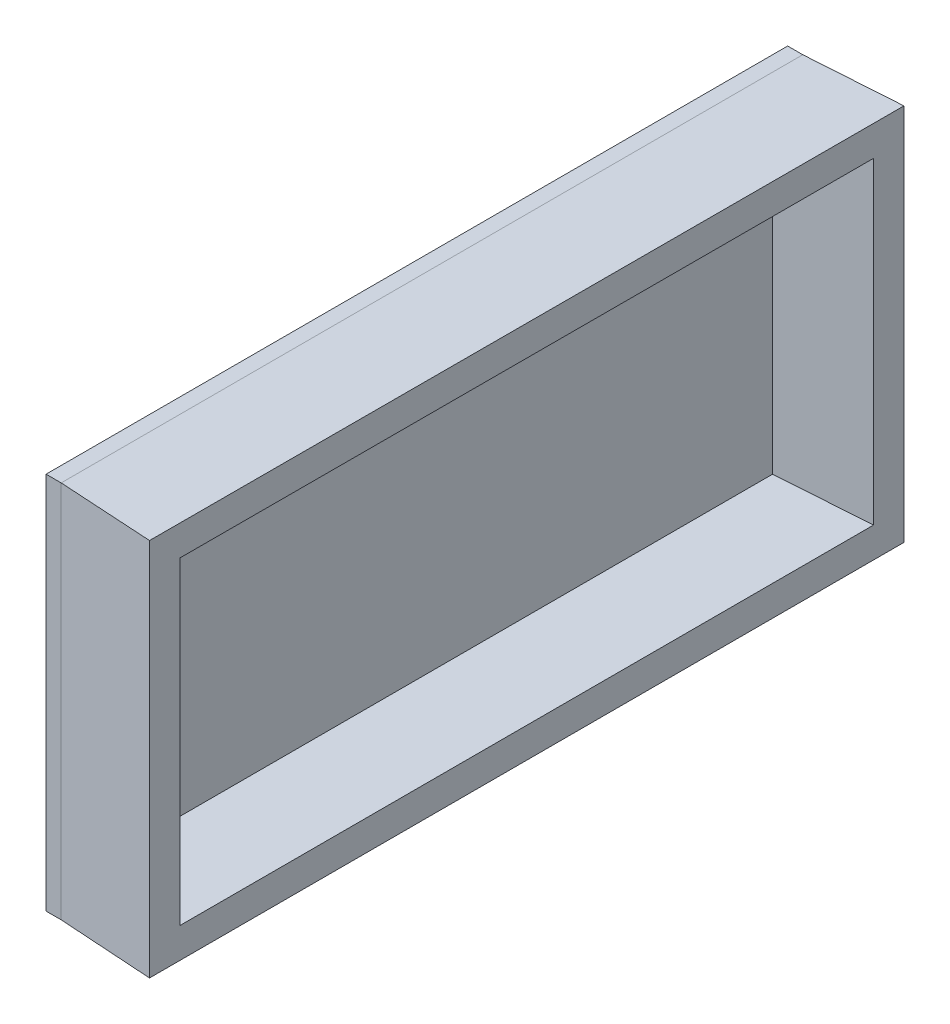
ISO-10303-21;
HEADER;
FILE_DESCRIPTION(('STEP AP214'),'2;1');
FILE_NAME('part.step','',(''),(''),'','','');
FILE_SCHEMA(('AUTOMOTIVE_DESIGN { 1 0 10303 214 1 1 1 1 }'));
ENDSEC;
DATA;
#1=APPLICATION_CONTEXT('core data for automotive mechanical design processes');
#2=APPLICATION_PROTOCOL_DEFINITION('international standard','automotive_design',2000,#1);
#3=PRODUCT_CONTEXT('',#1,'mechanical');
#4=PRODUCT('Part','Part','',(#3));
#5=PRODUCT_RELATED_PRODUCT_CATEGORY('part','',(#4));
#6=PRODUCT_DEFINITION_FORMATION('','',#4);
#7=PRODUCT_DEFINITION_CONTEXT('part definition',#1,'design');
#8=PRODUCT_DEFINITION('design','',#6,#7);
#9=PRODUCT_DEFINITION_SHAPE('','',#8);
#10=(LENGTH_UNIT() NAMED_UNIT(*) SI_UNIT(.MILLI.,.METRE.));
#11=(NAMED_UNIT(*) PLANE_ANGLE_UNIT() SI_UNIT($,.RADIAN.));
#12=(NAMED_UNIT(*) SI_UNIT($,.STERADIAN.) SOLID_ANGLE_UNIT());
#13=UNCERTAINTY_MEASURE_WITH_UNIT(LENGTH_MEASURE(1.E-05),#10,'distance_accuracy_value','');
#14=(GEOMETRIC_REPRESENTATION_CONTEXT(3) GLOBAL_UNCERTAINTY_ASSIGNED_CONTEXT((#13)) GLOBAL_UNIT_ASSIGNED_CONTEXT((#10,
#11,#12)) REPRESENTATION_CONTEXT('',''));
#15=CARTESIAN_POINT('',(0.,0.,0.));
#16=DIRECTION('',(0.,0.,1.));
#17=DIRECTION('',(1.,0.,0.));
#18=AXIS2_PLACEMENT_3D('',#15,#16,#17);
#19=CARTESIAN_POINT('',(953.18903961964,0.,0.));
#20=DIRECTION('',(-1.,0.,0.));
#21=DIRECTION('',(0.,0.,1.));
#22=AXIS2_PLACEMENT_3D('',#19,#20,#21);
#23=PLANE('',#22);
#24=DIRECTION('',(0.,0.00105708186182753,0.999999441288813));
#25=VECTOR('',#24,1.);
#26=CARTESIAN_POINT('',(953.18903961964,229.512012877825,249.48866382897));
#27=LINE('',#26,#25);
#28=CARTESIAN_POINT('',(953.18903961964,228.984698802759,-249.350451183405));
#29=VERTEX_POINT('',#28);
#30=CARTESIAN_POINT('',(953.18903961964,229.512012877825,249.48866382897));
#31=VERTEX_POINT('',#30);
#32=EDGE_CURVE('E280',#29,#31,#27,.T.);
#33=ORIENTED_EDGE('',*,*,#32,.T.);
#34=DIRECTION('',(0.,-1.,0.));
#35=VECTOR('',#34,1.);
#36=CARTESIAN_POINT('',(953.18903961964,-21.,249.48866382897));
#37=LINE('',#36,#35);
#38=CARTESIAN_POINT('',(953.18903961964,-21.,249.48866382897));
#39=VERTEX_POINT('',#38);
#40=EDGE_CURVE('E11',#31,#39,#37,.T.);
#41=ORIENTED_EDGE('',*,*,#40,.T.);
#42=DIRECTION('',(0.,0.,-1.));
#43=VECTOR('',#42,1.);
#44=CARTESIAN_POINT('',(953.18903961964,-21.,-249.350451183405));
#45=LINE('',#44,#43);
#46=CARTESIAN_POINT('',(953.18903961964,-21.,-249.350451183405));
#47=VERTEX_POINT('',#46);
#48=EDGE_CURVE('E45',#39,#47,#45,.T.);
#49=ORIENTED_EDGE('',*,*,#48,.T.);
#50=DIRECTION('',(0.,1.,0.));
#51=VECTOR('',#50,1.);
#52=CARTESIAN_POINT('',(953.18903961964,228.984698802759,-249.350451183405));
#53=LINE('',#52,#51);
#54=EDGE_CURVE('E368',#47,#29,#53,.T.);
#55=ORIENTED_EDGE('',*,*,#54,.T.);
#56=EDGE_LOOP('',(#33,#41,#49,#55));
#57=FACE_BOUND('',#56,.T.);
#58=CARTESIAN_POINT('',(953.189039619641,209.005774571627,-229.301282817721));
#59=CARTESIAN_POINT('',(953.18903961964,209.049989903322,-187.516507975107));
#60=CARTESIAN_POINT('',(953.18903961964,209.094190758072,-145.731733117174));
#61=CARTESIAN_POINT('',(953.18903961964,209.18256351175,-62.1621833706875));
#62=CARTESIAN_POINT('',(953.18903961964,209.226735410678,-20.3774084821344));
#63=CARTESIAN_POINT('',(953.189039619641,209.344176641885,90.7535272655082));
#64=CARTESIAN_POINT('',(953.189039619641,209.417420574102,160.099688151441));
#65=CARTESIAN_POINT('',(953.18903961964,209.490624622963,229.445849079479));
#66=B_SPLINE_CURVE_WITH_KNOTS('',3,(#58,#59,#60,#61,#62,#63,#64,#65),.UNSPECIFIED.,.F.,.F.,(4,2,
2,4),(0.,125.354394708726,250.708789417452,458.747388116354),.UNSPECIFIED.);
#67=CARTESIAN_POINT('',(953.18903961964,209.005774571627,-229.301282817721));
#68=VERTEX_POINT('',#67);
#69=CARTESIAN_POINT('',(953.18903961964,209.490624622963,229.445849079479));
#70=VERTEX_POINT('',#69);
#71=EDGE_CURVE('E381',#68,#70,#66,.T.);
#72=ORIENTED_EDGE('',*,*,#71,.F.);
#73=DIRECTION('',(0.,1.,0.));
#74=VECTOR('',#73,1.);
#75=CARTESIAN_POINT('',(953.18903961964,-1.01836458383072E-13,-229.301282817721));
#76=LINE('',#75,#74);
#77=CARTESIAN_POINT('',(953.18903961964,-1.,-229.301282817721));
#78=VERTEX_POINT('',#77);
#79=EDGE_CURVE('E383',#78,#68,#76,.T.);
#80=ORIENTED_EDGE('',*,*,#79,.F.);
#81=DIRECTION('',(0.,0.,-1.));
#82=VECTOR('',#81,1.);
#83=CARTESIAN_POINT('',(953.18903961964,-1.,0.));
#84=LINE('',#83,#82);
#85=CARTESIAN_POINT('',(953.18903961964,-1.,229.445849079479));
#86=VERTEX_POINT('',#85);
#87=EDGE_CURVE('E385',#86,#78,#84,.T.);
#88=ORIENTED_EDGE('',*,*,#87,.F.);
#89=DIRECTION('',(0.,-1.,0.));
#90=VECTOR('',#89,1.);
#91=CARTESIAN_POINT('',(953.18903961964,0.,229.445849079479));
#92=LINE('',#91,#90);
#93=EDGE_CURVE('E210',#70,#86,#92,.T.);
#94=ORIENTED_EDGE('',*,*,#93,.F.);
#95=EDGE_LOOP('',(#72,#80,#88,#94));
#96=FACE_BOUND('',#95,.T.);
#97=ADVANCED_FACE('F35',(#57,#96),#23,.F.);
#98=CARTESIAN_POINT('',(890.06403961964,229.21658426261,-244.92139659473));
#99=CARTESIAN_POINT('',(890.68903961964,229.214288366968,-244.96524862036));
#100=CARTESIAN_POINT('',(953.18903961964,228.984698802759,-249.350451183405));
#101=CARTESIAN_POINT('',(953.81403961964,228.982402907117,-249.394303209036));
#102=CARTESIAN_POINT('',(890.06403961964,229.215705405819,-163.208497668215));
#103=CARTESIAN_POINT('',(890.68903961964,229.214288366968,-163.238221440622));
#104=CARTESIAN_POINT('',(953.18903961964,229.072584481936,-166.210598681345));
#105=CARTESIAN_POINT('',(953.81403961964,229.071167443086,-166.240322453752));
#106=CARTESIAN_POINT('',(890.06403961964,229.214826549027,-81.4955987417));
#107=CARTESIAN_POINT('',(890.68903961964,229.214288366968,-81.511194260884));
#108=CARTESIAN_POINT('',(953.18903961964,229.160470161114,-83.0707461792831));
#109=CARTESIAN_POINT('',(953.81403961964,229.159931979055,-83.0863416984671));
#110=CARTESIAN_POINT('',(890.06403961964,229.213068835443,81.9301991113302));
#111=CARTESIAN_POINT('',(890.68903961964,229.214288366968,81.9428600985927));
#112=CARTESIAN_POINT('',(953.18903961964,229.336241519469,83.208958824842));
#113=CARTESIAN_POINT('',(953.81403961964,229.337461050994,83.2216198121045));
#114=CARTESIAN_POINT('',(890.06403961964,229.212189978652,163.643098037845));
#115=CARTESIAN_POINT('',(890.68903961964,229.214288366968,163.669887278331));
#116=CARTESIAN_POINT('',(953.18903961964,229.424127198647,166.348811326905));
#117=CARTESIAN_POINT('',(953.81403961964,229.426225586964,166.375600567391));
#118=CARTESIAN_POINT('',(890.06403961964,229.21131112186,245.355996964361));
#119=CARTESIAN_POINT('',(890.68903961964,229.214288366968,245.39691445807));
#120=CARTESIAN_POINT('',(953.18903961964,229.512012877825,249.48866382897));
#121=CARTESIAN_POINT('',(953.81403961964,229.514990122933,249.529581322679));
#122=B_SPLINE_SURFACE_WITH_KNOTS('',3,1,((#98,#99,#100,#101),(#102,#103,#104,#105),(#106,#107,
#108,#109),(#110,#111,#112,#113),(#114,#115,#116,#117),(#118,#119,#120,#121)),.UNSPECIFIED.,.F.,
.F.,.F.,(4,2,4),(2,1,1,2),(0.,0.5,1.),(-0.01,0.,1.,1.01),.UNSPECIFIED.);
#123=DIRECTION('',(0.,0.,1.));
#124=VECTOR('',#123,1.);
#125=CARTESIAN_POINT('',(890.68903961964,229.214288366968,245.39691445807));
#126=LINE('',#125,#124);
#127=CARTESIAN_POINT('',(890.68903961964,229.214288366968,-244.96524862036));
#128=VERTEX_POINT('',#127);
#129=CARTESIAN_POINT('',(890.68903961964,229.214288366968,245.39691445807));
#130=VERTEX_POINT('',#129);
#131=EDGE_CURVE('E194',#128,#130,#126,.T.);
#132=DIRECTION('',(0.997852562333642,0.00475336265643895,0.06532740150688));
#133=VECTOR('',#132,1.);
#134=CARTESIAN_POINT('',(921.93903961964,229.363150622396,247.44278914352));
#135=LINE('',#134,#133);
#136=EDGE_CURVE('E319',#130,#31,#135,.T.);
#137=DIRECTION('',(-0.997540913244395,0.00366439973685017,0.0699907035120216));
#138=VECTOR('',#137,1.);
#139=CARTESIAN_POINT('',(921.93903961964,229.099493584863,-247.157849901883));
#140=LINE('',#139,#138);
#141=EDGE_CURVE('E317',#29,#128,#140,.T.);
#142=ORIENTED_EDGE('',*,*,#131,.T.);
#143=ORIENTED_EDGE('',*,*,#136,.T.);
#144=ORIENTED_EDGE('',*,*,#32,.F.);
#145=ORIENTED_EDGE('',*,*,#141,.T.);
#146=EDGE_LOOP('',(#142,#143,#144,#145));
#147=FACE_BOUND('',#146,.T.);
#148=ADVANCED_FACE('F253',(#147),#122,.T.);
#149=CARTESIAN_POINT('',(628.37966998904,0.,228.224047287393));
#150=DIRECTION('',(0.0653281395379539,0.,-0.997863835492854));
#151=DIRECTION('',(-0.997863835492854,0.,-0.0653281395379539));
#152=AXIS2_PLACEMENT_3D('',#149,#150,#151);
#153=PLANE('',#152);
#154=DIRECTION('',(0.997863835492854,0.,0.0653281395379538));
#155=VECTOR('',#154,1.);
#156=CARTESIAN_POINT('',(890.68903961964,-21.,245.39691445807));
#157=LINE('',#156,#155);
#158=CARTESIAN_POINT('',(890.68903961964,-21.,245.39691445807));
#159=VERTEX_POINT('',#158);
#160=EDGE_CURVE('E314',#159,#39,#157,.T.);
#161=ORIENTED_EDGE('',*,*,#160,.T.);
#162=ORIENTED_EDGE('',*,*,#40,.F.);
#163=ORIENTED_EDGE('',*,*,#136,.F.);
#164=DIRECTION('',(0.,-1.,0.));
#165=VECTOR('',#164,1.);
#166=CARTESIAN_POINT('',(890.68903961964,-21.,245.39691445807));
#167=LINE('',#166,#165);
#168=EDGE_CURVE('E160',#130,#159,#167,.T.);
#169=ORIENTED_EDGE('',*,*,#168,.T.);
#170=EDGE_LOOP('',(#161,#162,#163,#169));
#171=FACE_BOUND('',#170,.T.);
#172=ADVANCED_FACE('F258',(#171),#153,.F.);
#173=CARTESIAN_POINT('',(627.429479169248,-1.00589744536089E-13,-226.494104632631));
#174=DIRECTION('',(0.069991173428227,0.,0.997547610714466));
#175=DIRECTION('',(0.997547610714466,0.,-0.069991173428227));
#176=AXIS2_PLACEMENT_3D('',#173,#174,#175);
#177=PLANE('',#176);
#178=ORIENTED_EDGE('',*,*,#141,.F.);
#179=ORIENTED_EDGE('',*,*,#54,.F.);
#180=DIRECTION('',(0.997547610714466,0.,-0.0699911734282257));
#181=VECTOR('',#180,1.);
#182=CARTESIAN_POINT('',(890.68903961964,-21.,-244.96524862036));
#183=LINE('',#182,#181);
#184=CARTESIAN_POINT('',(890.68903961964,-21.,-244.96524862036));
#185=VERTEX_POINT('',#184);
#186=EDGE_CURVE('E307',#185,#47,#183,.T.);
#187=ORIENTED_EDGE('',*,*,#186,.F.);
#188=DIRECTION('',(0.,1.,0.));
#189=VECTOR('',#188,1.);
#190=CARTESIAN_POINT('',(890.68903961964,229.214288366968,-244.96524862036));
#191=LINE('',#190,#189);
#192=EDGE_CURVE('E39',#185,#128,#191,.T.);
#193=ORIENTED_EDGE('',*,*,#192,.T.);
#194=EDGE_LOOP('',(#178,#179,#187,#193));
#195=FACE_BOUND('',#194,.T.);
#196=ADVANCED_FACE('F288',(#195),#177,.F.);
#197=CARTESIAN_POINT('',(643.32103961964,-21.,0.));
#198=DIRECTION('',(0.,1.,0.));
#199=DIRECTION('',(0.,0.,1.));
#200=AXIS2_PLACEMENT_3D('',#197,#198,#199);
#201=PLANE('',#200);
#202=ORIENTED_EDGE('',*,*,#186,.T.);
#203=ORIENTED_EDGE('',*,*,#48,.F.);
#204=ORIENTED_EDGE('',*,*,#160,.F.);
#205=DIRECTION('',(1.,0.,0.));
#206=VECTOR('',#205,1.);
#207=CARTESIAN_POINT('',(880.68903961964,-21.,245.39691445807));
#208=LINE('',#207,#206);
#209=CARTESIAN_POINT('',(880.68903961964,-21.,245.39691445807));
#210=VERTEX_POINT('',#209);
#211=EDGE_CURVE('E123',#210,#159,#208,.T.);
#212=ORIENTED_EDGE('',*,*,#211,.F.);
#213=DIRECTION('',(0.,0.,1.));
#214=VECTOR('',#213,1.);
#215=CARTESIAN_POINT('',(880.68903961964,-21.,-244.96524862036));
#216=LINE('',#215,#214);
#217=CARTESIAN_POINT('',(880.68903961964,-21.,-244.96524862036));
#218=VERTEX_POINT('',#217);
#219=EDGE_CURVE('E115',#218,#210,#216,.T.);
#220=ORIENTED_EDGE('',*,*,#219,.F.);
#221=DIRECTION('',(1.,0.,0.));
#222=VECTOR('',#221,1.);
#223=CARTESIAN_POINT('',(880.68903961964,-21.,-244.96524862036));
#224=LINE('',#223,#222);
#225=EDGE_CURVE('E120',#218,#185,#224,.T.);
#226=ORIENTED_EDGE('',*,*,#225,.T.);
#227=EDGE_LOOP('',(#202,#203,#204,#212,#220,#226));
#228=FACE_BOUND('',#227,.T.);
#229=ADVANCED_FACE('F118',(#228),#201,.F.);
#230=CARTESIAN_POINT('',(890.06403961964,229.21658426261,-244.92139659473));
#231=CARTESIAN_POINT('',(953.81403961964,228.982402907117,-249.394303209036));
#232=CARTESIAN_POINT('',(890.06403961964,229.215705405819,-163.208497668215));
#233=CARTESIAN_POINT('',(953.81403961964,229.071167443086,-166.240322453752));
#234=CARTESIAN_POINT('',(890.06403961964,229.214826549027,-81.4955987417));
#235=CARTESIAN_POINT('',(953.81403961964,229.159931979055,-83.0863416984671));
#236=CARTESIAN_POINT('',(890.06403961964,229.213068835443,81.9301991113302));
#237=CARTESIAN_POINT('',(953.81403961964,229.337461050994,83.2216198121045));
#238=CARTESIAN_POINT('',(890.06403961964,229.212189978652,163.643098037845));
#239=CARTESIAN_POINT('',(953.81403961964,229.426225586964,166.375600567391));
#240=CARTESIAN_POINT('',(890.06403961964,229.21131112186,245.355996964361));
#241=CARTESIAN_POINT('',(953.81403961964,229.514990122933,249.529581322679));
#242=B_SPLINE_SURFACE_WITH_KNOTS('',3,1,((#230,#231),(#232,#233),(#234,#235),(#236,#237),(#238,
#239),(#240,#241)),.UNSPECIFIED.,.F.,.F.,.F.,(4,2,4),(2,2),(0.,0.5,1.),(-0.01,1.01),.UNSPECIFIED.);
#243=OFFSET_SURFACE('',#242,-20.,.F.);
#244=CARTESIAN_POINT('',(890.68903961964,209.214177584863,-224.916080254677));
#245=CARTESIAN_POINT('',(890.68903961964,209.214225440957,-183.13128201846));
#246=CARTESIAN_POINT('',(890.68903961964,209.214257792805,-141.346483782227));
#247=CARTESIAN_POINT('',(890.68903961964,209.214291485835,-57.7768873097474));
#248=CARTESIAN_POINT('',(890.68903961964,209.214292827017,-15.9920890735015));
#249=CARTESIAN_POINT('',(890.68903961964,209.214256111035,92.3131726780463));
#250=CARTESIAN_POINT('',(890.68903961964,209.214194260933,158.833636193341));
#251=CARTESIAN_POINT('',(890.68903961964,209.214093107083,225.354099708578));
#252=B_SPLINE_CURVE_WITH_KNOTS('',3,(#244,#245,#246,#247,#248,#249,#250,#251),.UNSPECIFIED.,.F.,
.F.,(4,2,2,4),(0.,125.354394708727,250.708789417454,450.270179963379),.UNSPECIFIED.);
#253=CARTESIAN_POINT('',(890.68903961964,209.214177584863,-224.916080254677));
#254=VERTEX_POINT('',#253);
#255=CARTESIAN_POINT('',(890.68903961964,209.214093107083,225.354099708578));
#256=VERTEX_POINT('',#255);
#257=EDGE_CURVE('E61',#254,#256,#252,.T.);
#258=ORIENTED_EDGE('',*,*,#257,.F.);
#259=CARTESIAN_POINT('',(953.18903961964,209.005774571627,-229.301282817721));
#260=CARTESIAN_POINT('',(947.978777840053,209.023178850431,-228.935713964762));
#261=CARTESIAN_POINT('',(942.768516035208,209.040575530925,-228.57014511003));
#262=CARTESIAN_POINT('',(932.347992374367,209.075353489492,-227.839007396977));
#263=CARTESIAN_POINT('',(927.13773051837,209.092734767565,-227.473438538656));
#264=CARTESIAN_POINT('',(911.514659068481,209.144829466677,-226.377273211221));
#265=CARTESIAN_POINT('',(901.101849397053,209.179519521582,-225.646676736667));
#266=CARTESIAN_POINT('',(890.68903961964,209.214177584863,-224.916080254677));
#267=B_SPLINE_CURVE_WITH_KNOTS('',3,(#259,#260,#261,#262,#263,#264,#265,#266),.UNSPECIFIED.,.F.,
.F.,(4,2,2,4),(0.,15.6692993386066,31.3385986772138,62.6539977445507),.UNSPECIFIED.);
#268=EDGE_CURVE('E235',#68,#254,#267,.T.);
#269=ORIENTED_EDGE('',*,*,#268,.F.);
#270=ORIENTED_EDGE('',*,*,#71,.T.);
#271=CARTESIAN_POINT('',(890.68903961964,209.214093107083,225.354099708578));
#272=CARTESIAN_POINT('',(895.900931332485,209.237123543922,225.695311782774));
#273=CARTESIAN_POINT('',(901.112823012207,209.260161508096,226.036523854802));
#274=CARTESIAN_POINT('',(911.536606306177,209.306252307433,226.71894799457));
#275=CARTESIAN_POINT('',(916.748497920425,209.329305142597,227.06016006231));
#276=CARTESIAN_POINT('',(932.36993966946,209.398422704711,228.082864453497));
#277=CARTESIAN_POINT('',(942.779489707544,209.444509382464,228.764356770612));
#278=CARTESIAN_POINT('',(953.18903961964,209.490624622963,229.445849079479));
#279=B_SPLINE_CURVE_WITH_KNOTS('',3,(#271,#272,#273,#274,#275,#276,#277,#278),.UNSPECIFIED.,.F.,
.F.,(4,2,2,4),(0.,15.6692993386058,31.3385986772114,62.6344065400835),.UNSPECIFIED.);
#280=EDGE_CURVE('E226',#256,#70,#279,.T.);
#281=ORIENTED_EDGE('',*,*,#280,.F.);
#282=EDGE_LOOP('',(#258,#269,#270,#281));
#283=FACE_BOUND('',#282,.T.);
#284=ADVANCED_FACE('F245',(#283),#243,.F.);
#285=CARTESIAN_POINT('',(629.686232779799,0.,208.266770577536));
#286=DIRECTION('',(0.0653281395379539,0.,-0.997863835492854));
#287=DIRECTION('',(-0.997863835492854,0.,-0.0653281395379539));
#288=AXIS2_PLACEMENT_3D('',#285,#286,#287);
#289=PLANE('',#288);
#290=DIRECTION('',(0.997863835492854,0.,0.0653281395379539));
#291=VECTOR('',#290,1.);
#292=CARTESIAN_POINT('',(629.686232779799,-1.,208.266770577536));
#293=LINE('',#292,#291);
#294=CARTESIAN_POINT('',(890.68903961964,-1.,225.354099708579));
#295=VERTEX_POINT('',#294);
#296=EDGE_CURVE('E234',#295,#86,#293,.T.);
#297=ORIENTED_EDGE('',*,*,#296,.F.);
#298=DIRECTION('',(0.,-1.,0.));
#299=VECTOR('',#298,1.);
#300=CARTESIAN_POINT('',(890.68903961964,0.,225.354099708579));
#301=LINE('',#300,#299);
#302=EDGE_CURVE('E143',#256,#295,#301,.T.);
#303=ORIENTED_EDGE('',*,*,#302,.F.);
#304=ORIENTED_EDGE('',*,*,#280,.T.);
#305=ORIENTED_EDGE('',*,*,#93,.T.);
#306=EDGE_LOOP('',(#297,#303,#304,#305));
#307=FACE_BOUND('',#306,.T.);
#308=ADVANCED_FACE('F242',(#307),#289,.T.);
#309=CARTESIAN_POINT('',(628.829302637812,0.,-206.543152418342));
#310=DIRECTION('',(0.069991173428227,0.,0.997547610714466));
#311=DIRECTION('',(0.997547610714466,0.,-0.069991173428227));
#312=AXIS2_PLACEMENT_3D('',#309,#310,#311);
#313=PLANE('',#312);
#314=ORIENTED_EDGE('',*,*,#268,.T.);
#315=DIRECTION('',(0.,1.,0.));
#316=VECTOR('',#315,1.);
#317=CARTESIAN_POINT('',(890.68903961964,0.,-224.916080254676));
#318=LINE('',#317,#316);
#319=CARTESIAN_POINT('',(890.68903961964,-1.,-224.916080254677));
#320=VERTEX_POINT('',#319);
#321=EDGE_CURVE('E407',#320,#254,#318,.T.);
#322=ORIENTED_EDGE('',*,*,#321,.F.);
#323=DIRECTION('',(0.997547610714466,0.,-0.069991173428227));
#324=VECTOR('',#323,1.);
#325=CARTESIAN_POINT('',(628.829302637812,-1.,-206.543152418342));
#326=LINE('',#325,#324);
#327=EDGE_CURVE('E53',#320,#78,#326,.T.);
#328=ORIENTED_EDGE('',*,*,#327,.T.);
#329=ORIENTED_EDGE('',*,*,#79,.T.);
#330=EDGE_LOOP('',(#314,#322,#328,#329));
#331=FACE_BOUND('',#330,.T.);
#332=ADVANCED_FACE('F248',(#331),#313,.T.);
#333=CARTESIAN_POINT('',(643.32103961964,-1.,0.));
#334=DIRECTION('',(0.,1.,0.));
#335=DIRECTION('',(0.,0.,1.));
#336=AXIS2_PLACEMENT_3D('',#333,#334,#335);
#337=PLANE('',#336);
#338=ORIENTED_EDGE('',*,*,#327,.F.);
#339=DIRECTION('',(0.,0.,-1.));
#340=VECTOR('',#339,1.);
#341=CARTESIAN_POINT('',(890.68903961964,-1.,0.));
#342=LINE('',#341,#340);
#343=EDGE_CURVE('E140',#295,#320,#342,.T.);
#344=ORIENTED_EDGE('',*,*,#343,.F.);
#345=ORIENTED_EDGE('',*,*,#296,.T.);
#346=ORIENTED_EDGE('',*,*,#87,.T.);
#347=EDGE_LOOP('',(#338,#344,#345,#346));
#348=FACE_BOUND('',#347,.T.);
#349=ADVANCED_FACE('F396',(#348),#337,.T.);
#350=CARTESIAN_POINT('',(890.68903961964,0.,0.));
#351=DIRECTION('',(-1.,0.,0.));
#352=DIRECTION('',(0.,0.,1.));
#353=AXIS2_PLACEMENT_3D('',#350,#351,#352);
#354=PLANE('',#353);
#355=ORIENTED_EDGE('',*,*,#321,.T.);
#356=ORIENTED_EDGE('',*,*,#257,.T.);
#357=ORIENTED_EDGE('',*,*,#302,.T.);
#358=ORIENTED_EDGE('',*,*,#343,.T.);
#359=EDGE_LOOP('',(#355,#356,#357,#358));
#360=FACE_BOUND('',#359,.T.);
#361=ADVANCED_FACE('F183',(#360),#354,.F.);
#362=CARTESIAN_POINT('',(880.68903961964,229.214288366968,-244.96524862036));
#363=DIRECTION('',(0.,0.,1.));
#364=DIRECTION('',(1.,0.,0.));
#365=AXIS2_PLACEMENT_3D('',#362,#363,#364);
#366=PLANE('',#365);
#367=ORIENTED_EDGE('',*,*,#192,.F.);
#368=ORIENTED_EDGE('',*,*,#225,.F.);
#369=DIRECTION('',(0.,-1.,0.));
#370=VECTOR('',#369,1.);
#371=CARTESIAN_POINT('',(880.68903961964,229.214288366968,-244.96524862036));
#372=LINE('',#371,#370);
#373=CARTESIAN_POINT('',(880.68903961964,229.214288366968,-244.96524862036));
#374=VERTEX_POINT('',#373);
#375=EDGE_CURVE('E127',#374,#218,#372,.T.);
#376=ORIENTED_EDGE('',*,*,#375,.F.);
#377=DIRECTION('',(1.,0.,0.));
#378=VECTOR('',#377,1.);
#379=CARTESIAN_POINT('',(880.68903961964,229.214288366968,-244.96524862036));
#380=LINE('',#379,#378);
#381=EDGE_CURVE('E216',#374,#128,#380,.T.);
#382=ORIENTED_EDGE('',*,*,#381,.T.);
#383=EDGE_LOOP('',(#367,#368,#376,#382));
#384=FACE_BOUND('',#383,.T.);
#385=ADVANCED_FACE('F137',(#384),#366,.F.);
#386=CARTESIAN_POINT('',(880.68903961964,229.214288366968,245.39691445807));
#387=DIRECTION('',(0.,0.,-1.));
#388=DIRECTION('',(-1.,0.,0.));
#389=AXIS2_PLACEMENT_3D('',#386,#387,#388);
#390=PLANE('',#389);
#391=ORIENTED_EDGE('',*,*,#168,.F.);
#392=DIRECTION('',(1.,0.,0.));
#393=VECTOR('',#392,1.);
#394=CARTESIAN_POINT('',(880.68903961964,229.214288366968,245.39691445807));
#395=LINE('',#394,#393);
#396=CARTESIAN_POINT('',(880.68903961964,229.214288366968,245.39691445807));
#397=VERTEX_POINT('',#396);
#398=EDGE_CURVE('E145',#397,#130,#395,.T.);
#399=ORIENTED_EDGE('',*,*,#398,.F.);
#400=DIRECTION('',(0.,1.,0.));
#401=VECTOR('',#400,1.);
#402=CARTESIAN_POINT('',(880.68903961964,229.214288366968,245.39691445807));
#403=LINE('',#402,#401);
#404=EDGE_CURVE('E126',#210,#397,#403,.T.);
#405=ORIENTED_EDGE('',*,*,#404,.F.);
#406=ORIENTED_EDGE('',*,*,#211,.T.);
#407=EDGE_LOOP('',(#391,#399,#405,#406));
#408=FACE_BOUND('',#407,.T.);
#409=ADVANCED_FACE('F167',(#408),#390,.F.);
#410=CARTESIAN_POINT('',(880.68903961964,229.214288366968,-244.96524862036));
#411=DIRECTION('',(0.,-1.,0.));
#412=DIRECTION('',(0.,0.,-1.));
#413=AXIS2_PLACEMENT_3D('',#410,#411,#412);
#414=PLANE('',#413);
#415=ORIENTED_EDGE('',*,*,#131,.F.);
#416=ORIENTED_EDGE('',*,*,#381,.F.);
#417=DIRECTION('',(0.,0.,-1.));
#418=VECTOR('',#417,1.);
#419=CARTESIAN_POINT('',(880.68903961964,229.214288366968,-244.96524862036));
#420=LINE('',#419,#418);
#421=EDGE_CURVE('E132',#397,#374,#420,.T.);
#422=ORIENTED_EDGE('',*,*,#421,.F.);
#423=ORIENTED_EDGE('',*,*,#398,.T.);
#424=EDGE_LOOP('',(#415,#416,#422,#423));
#425=FACE_BOUND('',#424,.T.);
#426=ADVANCED_FACE('F177',(#425),#414,.F.);
#427=CARTESIAN_POINT('',(880.68903961964,0.,0.));
#428=DIRECTION('',(-1.,0.,0.));
#429=DIRECTION('',(0.,0.,1.));
#430=AXIS2_PLACEMENT_3D('',#427,#428,#429);
#431=PLANE('',#430);
#432=ORIENTED_EDGE('',*,*,#375,.T.);
#433=ORIENTED_EDGE('',*,*,#219,.T.);
#434=ORIENTED_EDGE('',*,*,#404,.T.);
#435=ORIENTED_EDGE('',*,*,#421,.T.);
#436=EDGE_LOOP('',(#432,#433,#434,#435));
#437=FACE_BOUND('',#436,.T.);
#438=ADVANCED_FACE('F130',(#437),#431,.T.);
#439=CLOSED_SHELL('',(#97,#148,#172,#196,#229,#284,#308,#332,#349,#361,#385,#409,#426,#438));
#440=MANIFOLD_SOLID_BREP('B2',#439);
#441=ADVANCED_BREP_SHAPE_REPRESENTATION('',(#18,#440),#14);
#442=SHAPE_DEFINITION_REPRESENTATION(#9,#441);
ENDSEC;
END-ISO-10303-21;
